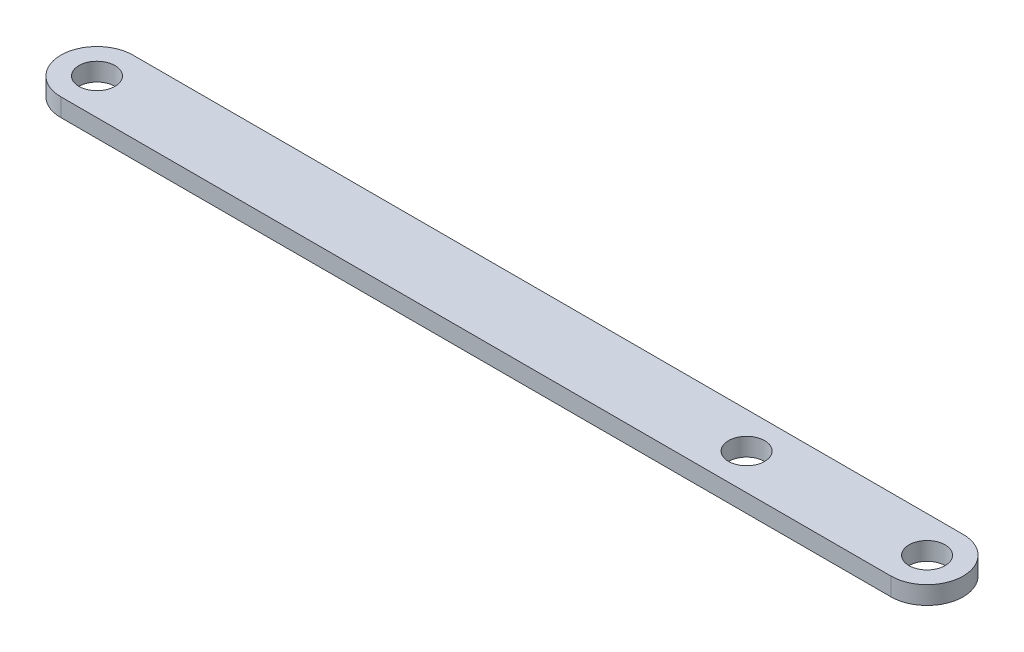
ISO-10303-21;
HEADER;
FILE_DESCRIPTION(('STEP AP214'),'2;1');
FILE_NAME('part.step','',(''),(''),'','','');
FILE_SCHEMA(('AUTOMOTIVE_DESIGN { 1 0 10303 214 1 1 1 1 }'));
ENDSEC;
DATA;
#1=APPLICATION_CONTEXT('core data for automotive mechanical design processes');
#2=APPLICATION_PROTOCOL_DEFINITION('international standard','automotive_design',2000,#1);
#3=PRODUCT_CONTEXT('',#1,'mechanical');
#4=PRODUCT('Part','Part','',(#3));
#5=PRODUCT_RELATED_PRODUCT_CATEGORY('part','',(#4));
#6=PRODUCT_DEFINITION_FORMATION('','',#4);
#7=PRODUCT_DEFINITION_CONTEXT('part definition',#1,'design');
#8=PRODUCT_DEFINITION('design','',#6,#7);
#9=PRODUCT_DEFINITION_SHAPE('','',#8);
#10=(LENGTH_UNIT() NAMED_UNIT(*) SI_UNIT(.MILLI.,.METRE.));
#11=(NAMED_UNIT(*) PLANE_ANGLE_UNIT() SI_UNIT($,.RADIAN.));
#12=(NAMED_UNIT(*) SI_UNIT($,.STERADIAN.) SOLID_ANGLE_UNIT());
#13=UNCERTAINTY_MEASURE_WITH_UNIT(LENGTH_MEASURE(1.E-05),#10,'distance_accuracy_value','');
#14=(GEOMETRIC_REPRESENTATION_CONTEXT(3) GLOBAL_UNCERTAINTY_ASSIGNED_CONTEXT((#13)) GLOBAL_UNIT_ASSIGNED_CONTEXT((#10,
#11,#12)) REPRESENTATION_CONTEXT('',''));
#15=CARTESIAN_POINT('',(0.,0.,0.));
#16=DIRECTION('',(0.,0.,1.));
#17=DIRECTION('',(1.,0.,0.));
#18=AXIS2_PLACEMENT_3D('',#15,#16,#17);
#19=CARTESIAN_POINT('',(-72.3468097091892,5.,0.));
#20=DIRECTION('',(0.,1.,0.));
#21=DIRECTION('',(0.,0.,1.));
#22=AXIS2_PLACEMENT_3D('',#19,#20,#21);
#23=PLANE('',#22);
#24=CARTESIAN_POINT('',(107.653190290811,5.,0.));
#25=DIRECTION('',(0.,1.,0.));
#26=DIRECTION('',(0.,0.,1.));
#27=AXIS2_PLACEMENT_3D('',#24,#25,#26);
#28=CIRCLE('',#27,4.99999999999999);
#29=CARTESIAN_POINT('',(107.653190290811,5.,4.99999999999999));
#30=VERTEX_POINT('',#29);
#31=EDGE_CURVE('E150',#30,#30,#28,.T.);
#32=ORIENTED_EDGE('',*,*,#31,.F.);
#33=EDGE_LOOP('',(#32));
#34=FACE_BOUND('',#33,.T.);
#35=CARTESIAN_POINT('',(-72.3468097091892,5.,0.));
#36=DIRECTION('',(0.,1.,0.));
#37=DIRECTION('',(0.,0.,1.));
#38=AXIS2_PLACEMENT_3D('',#35,#36,#37);
#39=CIRCLE('',#38,5.);
#40=CARTESIAN_POINT('',(-72.3468097091892,5.,5.));
#41=VERTEX_POINT('',#40);
#42=EDGE_CURVE('E117',#41,#41,#39,.T.);
#43=ORIENTED_EDGE('',*,*,#42,.F.);
#44=EDGE_LOOP('',(#43));
#45=FACE_BOUND('',#44,.T.);
#46=CARTESIAN_POINT('',(-72.3468097091892,5.,0.));
#47=DIRECTION('',(0.,1.,0.));
#48=DIRECTION('',(0.,0.,1.));
#49=AXIS2_PLACEMENT_3D('',#46,#47,#48);
#50=CIRCLE('',#49,10.);
#51=CARTESIAN_POINT('',(-72.3468097091892,5.,-10.));
#52=VERTEX_POINT('',#51);
#53=CARTESIAN_POINT('',(-72.3468097091892,5.,10.));
#54=VERTEX_POINT('',#53);
#55=EDGE_CURVE('E96',#52,#54,#50,.T.);
#56=ORIENTED_EDGE('',*,*,#55,.T.);
#57=DIRECTION('',(1.,0.,0.));
#58=VECTOR('',#57,1.);
#59=CARTESIAN_POINT('',(-72.3468097091892,5.,10.));
#60=LINE('',#59,#58);
#61=CARTESIAN_POINT('',(157.653190290811,5.,10.));
#62=VERTEX_POINT('',#61);
#63=EDGE_CURVE('E91',#54,#62,#60,.T.);
#64=ORIENTED_EDGE('',*,*,#63,.T.);
#65=CARTESIAN_POINT('',(157.653190290811,5.,0.));
#66=DIRECTION('',(0.,1.,0.));
#67=DIRECTION('',(0.,0.,1.));
#68=AXIS2_PLACEMENT_3D('',#65,#66,#67);
#69=CIRCLE('',#68,10.);
#70=CARTESIAN_POINT('',(157.653190290811,5.,-10.));
#71=VERTEX_POINT('',#70);
#72=EDGE_CURVE('E94',#62,#71,#69,.T.);
#73=ORIENTED_EDGE('',*,*,#72,.T.);
#74=DIRECTION('',(-1.,0.,0.));
#75=VECTOR('',#74,1.);
#76=CARTESIAN_POINT('',(-72.3468097091892,5.,-10.));
#77=LINE('',#76,#75);
#78=EDGE_CURVE('E61',#71,#52,#77,.T.);
#79=ORIENTED_EDGE('',*,*,#78,.T.);
#80=EDGE_LOOP('',(#56,#64,#73,#79));
#81=FACE_BOUND('',#80,.T.);
#82=CARTESIAN_POINT('',(157.653190290811,5.,0.));
#83=DIRECTION('',(0.,1.,0.));
#84=DIRECTION('',(0.,0.,1.));
#85=AXIS2_PLACEMENT_3D('',#82,#83,#84);
#86=CIRCLE('',#85,5.00000000000002);
#87=CARTESIAN_POINT('',(157.653190290811,5.,5.00000000000002));
#88=VERTEX_POINT('',#87);
#89=EDGE_CURVE('E139',#88,#88,#86,.T.);
#90=ORIENTED_EDGE('',*,*,#89,.F.);
#91=EDGE_LOOP('',(#90));
#92=FACE_BOUND('',#91,.T.);
#93=ADVANCED_FACE('F42',(#34,#45,#81,#92),#23,.T.);
#94=CARTESIAN_POINT('',(-72.3468097091892,0.,0.));
#95=DIRECTION('',(0.,1.,0.));
#96=DIRECTION('',(0.,0.,1.));
#97=AXIS2_PLACEMENT_3D('',#94,#95,#96);
#98=PLANE('',#97);
#99=CARTESIAN_POINT('',(107.653190290811,0.,0.));
#100=DIRECTION('',(0.,1.,0.));
#101=DIRECTION('',(0.,0.,1.));
#102=AXIS2_PLACEMENT_3D('',#99,#100,#101);
#103=CIRCLE('',#102,4.99999999999999);
#104=CARTESIAN_POINT('',(107.653190290811,0.,4.99999999999999));
#105=VERTEX_POINT('',#104);
#106=EDGE_CURVE('E46',#105,#105,#103,.T.);
#107=ORIENTED_EDGE('',*,*,#106,.T.);
#108=EDGE_LOOP('',(#107));
#109=FACE_BOUND('',#108,.T.);
#110=CARTESIAN_POINT('',(-72.3468097091892,0.,0.));
#111=DIRECTION('',(0.,1.,0.));
#112=DIRECTION('',(0.,0.,1.));
#113=AXIS2_PLACEMENT_3D('',#110,#111,#112);
#114=CIRCLE('',#113,10.);
#115=CARTESIAN_POINT('',(-72.3468097091892,0.,-10.));
#116=VERTEX_POINT('',#115);
#117=CARTESIAN_POINT('',(-72.3468097091892,0.,10.));
#118=VERTEX_POINT('',#117);
#119=EDGE_CURVE('E113',#116,#118,#114,.T.);
#120=ORIENTED_EDGE('',*,*,#119,.F.);
#121=DIRECTION('',(-1.,0.,0.));
#122=VECTOR('',#121,1.);
#123=CARTESIAN_POINT('',(-72.3468097091892,0.,-10.));
#124=LINE('',#123,#122);
#125=CARTESIAN_POINT('',(157.653190290811,0.,-10.));
#126=VERTEX_POINT('',#125);
#127=EDGE_CURVE('E84',#126,#116,#124,.T.);
#128=ORIENTED_EDGE('',*,*,#127,.F.);
#129=CARTESIAN_POINT('',(157.653190290811,0.,0.));
#130=DIRECTION('',(0.,1.,0.));
#131=DIRECTION('',(0.,0.,1.));
#132=AXIS2_PLACEMENT_3D('',#129,#130,#131);
#133=CIRCLE('',#132,10.);
#134=CARTESIAN_POINT('',(157.653190290811,0.,10.));
#135=VERTEX_POINT('',#134);
#136=EDGE_CURVE('E78',#135,#126,#133,.T.);
#137=ORIENTED_EDGE('',*,*,#136,.F.);
#138=DIRECTION('',(1.,0.,0.));
#139=VECTOR('',#138,1.);
#140=CARTESIAN_POINT('',(-72.3468097091892,0.,10.));
#141=LINE('',#140,#139);
#142=EDGE_CURVE('E101',#118,#135,#141,.T.);
#143=ORIENTED_EDGE('',*,*,#142,.F.);
#144=EDGE_LOOP('',(#120,#128,#137,#143));
#145=FACE_BOUND('',#144,.T.);
#146=CARTESIAN_POINT('',(-72.3468097091892,0.,0.));
#147=DIRECTION('',(0.,1.,0.));
#148=DIRECTION('',(0.,0.,1.));
#149=AXIS2_PLACEMENT_3D('',#146,#147,#148);
#150=CIRCLE('',#149,5.);
#151=CARTESIAN_POINT('',(-72.3468097091892,0.,5.));
#152=VERTEX_POINT('',#151);
#153=EDGE_CURVE('E135',#152,#152,#150,.T.);
#154=ORIENTED_EDGE('',*,*,#153,.T.);
#155=EDGE_LOOP('',(#154));
#156=FACE_BOUND('',#155,.T.);
#157=CARTESIAN_POINT('',(157.653190290811,0.,0.));
#158=DIRECTION('',(0.,1.,0.));
#159=DIRECTION('',(0.,0.,1.));
#160=AXIS2_PLACEMENT_3D('',#157,#158,#159);
#161=CIRCLE('',#160,5.00000000000002);
#162=CARTESIAN_POINT('',(157.653190290811,0.,5.00000000000002));
#163=VERTEX_POINT('',#162);
#164=EDGE_CURVE('E143',#163,#163,#161,.T.);
#165=ORIENTED_EDGE('',*,*,#164,.T.);
#166=EDGE_LOOP('',(#165));
#167=FACE_BOUND('',#166,.T.);
#168=ADVANCED_FACE('F130',(#109,#145,#156,#167),#98,.F.);
#169=CARTESIAN_POINT('',(-72.3468097091892,5.,0.));
#170=DIRECTION('',(0.,-1.,0.));
#171=DIRECTION('',(0.,0.,-1.));
#172=AXIS2_PLACEMENT_3D('',#169,#170,#171);
#173=CYLINDRICAL_SURFACE('',#172,10.);
#174=ORIENTED_EDGE('',*,*,#119,.T.);
#175=DIRECTION('',(0.,-1.,0.));
#176=VECTOR('',#175,1.);
#177=CARTESIAN_POINT('',(-72.3468097091892,5.,10.));
#178=LINE('',#177,#176);
#179=EDGE_CURVE('E11',#54,#118,#178,.T.);
#180=ORIENTED_EDGE('',*,*,#179,.F.);
#181=ORIENTED_EDGE('',*,*,#55,.F.);
#182=DIRECTION('',(0.,-1.,0.));
#183=VECTOR('',#182,1.);
#184=CARTESIAN_POINT('',(-72.3468097091892,5.,-10.));
#185=LINE('',#184,#183);
#186=EDGE_CURVE('E109',#52,#116,#185,.T.);
#187=ORIENTED_EDGE('',*,*,#186,.T.);
#188=EDGE_LOOP('',(#174,#180,#181,#187));
#189=FACE_BOUND('',#188,.T.);
#190=ADVANCED_FACE('F44',(#189),#173,.T.);
#191=CARTESIAN_POINT('',(-72.3468097091892,5.,10.));
#192=DIRECTION('',(0.,0.,-1.));
#193=DIRECTION('',(-1.,0.,0.));
#194=AXIS2_PLACEMENT_3D('',#191,#192,#193);
#195=PLANE('',#194);
#196=ORIENTED_EDGE('',*,*,#142,.T.);
#197=DIRECTION('',(0.,-1.,0.));
#198=VECTOR('',#197,1.);
#199=CARTESIAN_POINT('',(157.653190290811,5.,10.));
#200=LINE('',#199,#198);
#201=EDGE_CURVE('E53',#62,#135,#200,.T.);
#202=ORIENTED_EDGE('',*,*,#201,.F.);
#203=ORIENTED_EDGE('',*,*,#63,.F.);
#204=ORIENTED_EDGE('',*,*,#179,.T.);
#205=EDGE_LOOP('',(#196,#202,#203,#204));
#206=FACE_BOUND('',#205,.T.);
#207=ADVANCED_FACE('F100',(#206),#195,.F.);
#208=CARTESIAN_POINT('',(157.653190290811,5.,0.));
#209=DIRECTION('',(0.,-1.,0.));
#210=DIRECTION('',(0.,0.,-1.));
#211=AXIS2_PLACEMENT_3D('',#208,#209,#210);
#212=CYLINDRICAL_SURFACE('',#211,10.);
#213=ORIENTED_EDGE('',*,*,#136,.T.);
#214=DIRECTION('',(0.,-1.,0.));
#215=VECTOR('',#214,1.);
#216=CARTESIAN_POINT('',(157.653190290811,5.,-10.));
#217=LINE('',#216,#215);
#218=EDGE_CURVE('E103',#71,#126,#217,.T.);
#219=ORIENTED_EDGE('',*,*,#218,.F.);
#220=ORIENTED_EDGE('',*,*,#72,.F.);
#221=ORIENTED_EDGE('',*,*,#201,.T.);
#222=EDGE_LOOP('',(#213,#219,#220,#221));
#223=FACE_BOUND('',#222,.T.);
#224=ADVANCED_FACE('F105',(#223),#212,.T.);
#225=CARTESIAN_POINT('',(-72.3468097091892,5.,-10.));
#226=DIRECTION('',(0.,0.,1.));
#227=DIRECTION('',(1.,0.,0.));
#228=AXIS2_PLACEMENT_3D('',#225,#226,#227);
#229=PLANE('',#228);
#230=ORIENTED_EDGE('',*,*,#127,.T.);
#231=ORIENTED_EDGE('',*,*,#186,.F.);
#232=ORIENTED_EDGE('',*,*,#78,.F.);
#233=ORIENTED_EDGE('',*,*,#218,.T.);
#234=EDGE_LOOP('',(#230,#231,#232,#233));
#235=FACE_BOUND('',#234,.T.);
#236=ADVANCED_FACE('F127',(#235),#229,.F.);
#237=CARTESIAN_POINT('',(-72.3468097091892,5.,0.));
#238=DIRECTION('',(0.,-1.,0.));
#239=DIRECTION('',(0.,0.,-1.));
#240=AXIS2_PLACEMENT_3D('',#237,#238,#239);
#241=CYLINDRICAL_SURFACE('',#240,5.);
#242=ORIENTED_EDGE('',*,*,#42,.T.);
#243=EDGE_LOOP('',(#242));
#244=FACE_BOUND('',#243,.T.);
#245=ORIENTED_EDGE('',*,*,#153,.F.);
#246=EDGE_LOOP('',(#245));
#247=FACE_BOUND('',#246,.T.);
#248=ADVANCED_FACE('F167',(#244,#247),#241,.F.);
#249=CARTESIAN_POINT('',(157.653190290811,5.,0.));
#250=DIRECTION('',(0.,-1.,0.));
#251=DIRECTION('',(0.,0.,-1.));
#252=AXIS2_PLACEMENT_3D('',#249,#250,#251);
#253=CYLINDRICAL_SURFACE('',#252,5.00000000000002);
#254=ORIENTED_EDGE('',*,*,#89,.T.);
#255=EDGE_LOOP('',(#254));
#256=FACE_BOUND('',#255,.T.);
#257=ORIENTED_EDGE('',*,*,#164,.F.);
#258=EDGE_LOOP('',(#257));
#259=FACE_BOUND('',#258,.T.);
#260=ADVANCED_FACE('F162',(#256,#259),#253,.F.);
#261=CARTESIAN_POINT('',(107.653190290811,-5.,0.));
#262=DIRECTION('',(0.,1.,0.));
#263=DIRECTION('',(0.,0.,1.));
#264=AXIS2_PLACEMENT_3D('',#261,#262,#263);
#265=CYLINDRICAL_SURFACE('',#264,4.99999999999999);
#266=ORIENTED_EDGE('',*,*,#31,.T.);
#267=EDGE_LOOP('',(#266));
#268=FACE_BOUND('',#267,.T.);
#269=ORIENTED_EDGE('',*,*,#106,.F.);
#270=EDGE_LOOP('',(#269));
#271=FACE_BOUND('',#270,.T.);
#272=ADVANCED_FACE('F160',(#268,#271),#265,.F.);
#273=CLOSED_SHELL('',(#93,#168,#190,#207,#224,#236,#248,#260,#272));
#274=MANIFOLD_SOLID_BREP('B2',#273);
#275=ADVANCED_BREP_SHAPE_REPRESENTATION('',(#18,#274),#14);
#276=SHAPE_DEFINITION_REPRESENTATION(#9,#275);
ENDSEC;
END-ISO-10303-21;
